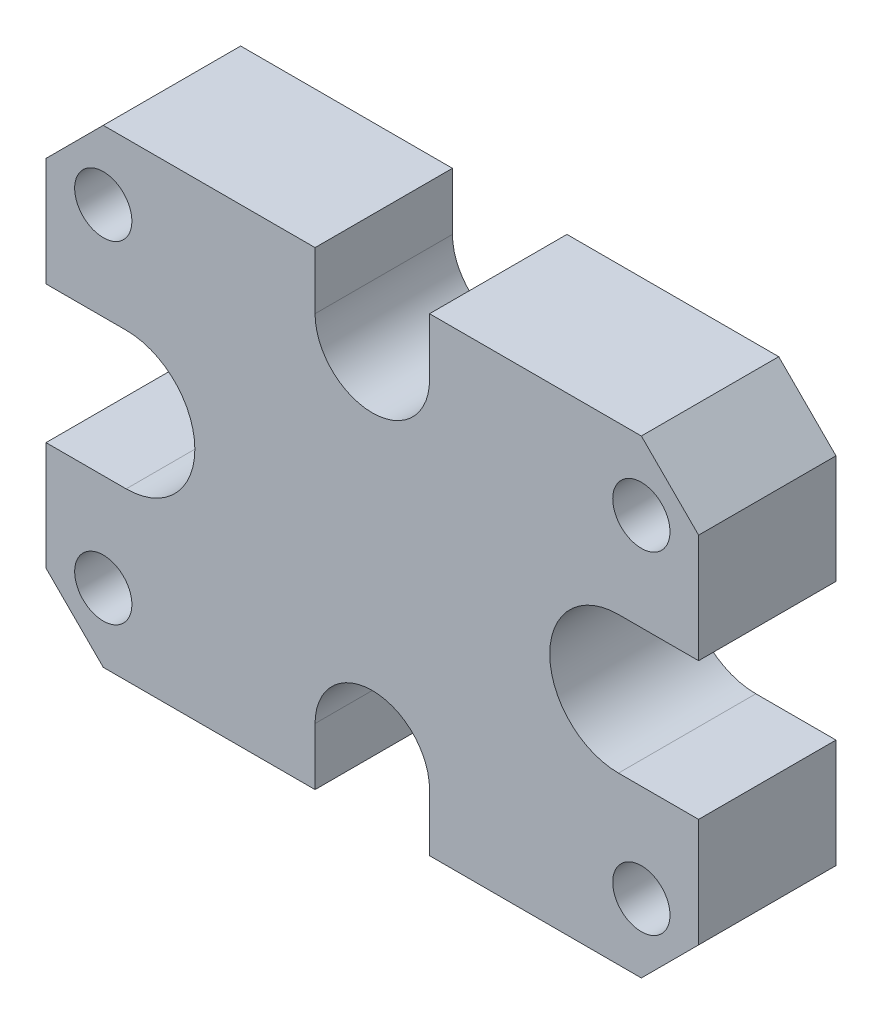
ISO-10303-21;
HEADER;
FILE_DESCRIPTION(('STEP AP214'),'2;1');
FILE_NAME('part.step','',(''),(''),'','','');
FILE_SCHEMA(('AUTOMOTIVE_DESIGN { 1 0 10303 214 1 1 1 1 }'));
ENDSEC;
DATA;
#1=APPLICATION_CONTEXT('core data for automotive mechanical design processes');
#2=APPLICATION_PROTOCOL_DEFINITION('international standard','automotive_design',2000,#1);
#3=PRODUCT_CONTEXT('',#1,'mechanical');
#4=PRODUCT('Part','Part','',(#3));
#5=PRODUCT_RELATED_PRODUCT_CATEGORY('part','',(#4));
#6=PRODUCT_DEFINITION_FORMATION('','',#4);
#7=PRODUCT_DEFINITION_CONTEXT('part definition',#1,'design');
#8=PRODUCT_DEFINITION('design','',#6,#7);
#9=PRODUCT_DEFINITION_SHAPE('','',#8);
#10=(LENGTH_UNIT() NAMED_UNIT(*) SI_UNIT(.MILLI.,.METRE.));
#11=(NAMED_UNIT(*) PLANE_ANGLE_UNIT() SI_UNIT($,.RADIAN.));
#12=(NAMED_UNIT(*) SI_UNIT($,.STERADIAN.) SOLID_ANGLE_UNIT());
#13=UNCERTAINTY_MEASURE_WITH_UNIT(LENGTH_MEASURE(1.E-05),#10,'distance_accuracy_value','');
#14=(GEOMETRIC_REPRESENTATION_CONTEXT(3) GLOBAL_UNCERTAINTY_ASSIGNED_CONTEXT((#13)) GLOBAL_UNIT_ASSIGNED_CONTEXT((#10,
#11,#12)) REPRESENTATION_CONTEXT('',''));
#15=CARTESIAN_POINT('',(0.,0.,0.));
#16=DIRECTION('',(0.,0.,1.));
#17=DIRECTION('',(1.,0.,0.));
#18=AXIS2_PLACEMENT_3D('',#15,#16,#17);
#19=CARTESIAN_POINT('',(0.,31.,12.));
#20=DIRECTION('',(0.,0.,1.));
#21=DIRECTION('',(1.,0.,0.));
#22=AXIS2_PLACEMENT_3D('',#19,#20,#21);
#23=PLANE('',#22);
#24=CARTESIAN_POINT('',(47.,-29.,12.));
#25=DIRECTION('',(0.,0.,1.));
#26=DIRECTION('',(1.,0.,0.));
#27=AXIS2_PLACEMENT_3D('',#24,#25,#26);
#28=CIRCLE('',#27,5.);
#29=CARTESIAN_POINT('',(52.,-29.,12.));
#30=VERTEX_POINT('',#29);
#31=EDGE_CURVE('E447',#30,#30,#28,.T.);
#32=ORIENTED_EDGE('',*,*,#31,.F.);
#33=EDGE_LOOP('',(#32));
#34=FACE_BOUND('',#33,.T.);
#35=CARTESIAN_POINT('',(47.,29.,12.));
#36=DIRECTION('',(0.,0.,1.));
#37=DIRECTION('',(-1.,0.,0.));
#38=AXIS2_PLACEMENT_3D('',#35,#36,#37);
#39=CIRCLE('',#38,5.);
#40=CARTESIAN_POINT('',(42.,29.,12.));
#41=VERTEX_POINT('',#40);
#42=EDGE_CURVE('E230',#41,#41,#39,.T.);
#43=ORIENTED_EDGE('',*,*,#42,.F.);
#44=EDGE_LOOP('',(#43));
#45=FACE_BOUND('',#44,.T.);
#46=DIRECTION('',(-1.,0.,0.));
#47=VECTOR('',#46,1.);
#48=CARTESIAN_POINT('',(-47.,41.,12.));
#49=LINE('',#48,#47);
#50=CARTESIAN_POINT('',(-10.,41.,12.));
#51=VERTEX_POINT('',#50);
#52=CARTESIAN_POINT('',(-47.,41.,12.));
#53=VERTEX_POINT('',#52);
#54=EDGE_CURVE('E273',#51,#53,#49,.T.);
#55=ORIENTED_EDGE('',*,*,#54,.T.);
#56=DIRECTION('',(-0.707106781186548,-0.707106781186547,0.));
#57=VECTOR('',#56,1.);
#58=CARTESIAN_POINT('',(-57.,31.,12.));
#59=LINE('',#58,#57);
#60=CARTESIAN_POINT('',(-57.,31.,12.));
#61=VERTEX_POINT('',#60);
#62=EDGE_CURVE('E141',#53,#61,#59,.T.);
#63=ORIENTED_EDGE('',*,*,#62,.T.);
#64=DIRECTION('',(0.,-1.,0.));
#65=VECTOR('',#64,1.);
#66=CARTESIAN_POINT('',(-57.,31.,12.));
#67=LINE('',#66,#65);
#68=CARTESIAN_POINT('',(-57.,12.,12.));
#69=VERTEX_POINT('',#68);
#70=EDGE_CURVE('E336',#61,#69,#67,.T.);
#71=ORIENTED_EDGE('',*,*,#70,.T.);
#72=DIRECTION('',(1.,0.,0.));
#73=VECTOR('',#72,1.);
#74=CARTESIAN_POINT('',(-57.,12.,12.));
#75=LINE('',#74,#73);
#76=CARTESIAN_POINT('',(-43.,12.,12.));
#77=VERTEX_POINT('',#76);
#78=EDGE_CURVE('E355',#69,#77,#75,.T.);
#79=ORIENTED_EDGE('',*,*,#78,.T.);
#80=CARTESIAN_POINT('',(-43.,0.,12.));
#81=DIRECTION('',(0.,0.,-1.));
#82=DIRECTION('',(-1.,0.,0.));
#83=AXIS2_PLACEMENT_3D('',#80,#81,#82);
#84=CIRCLE('',#83,12.);
#85=CARTESIAN_POINT('',(-43.,-12.,12.));
#86=VERTEX_POINT('',#85);
#87=EDGE_CURVE('E352',#77,#86,#84,.T.);
#88=ORIENTED_EDGE('',*,*,#87,.T.);
#89=DIRECTION('',(-1.,0.,0.));
#90=VECTOR('',#89,1.);
#91=CARTESIAN_POINT('',(-43.,-12.,12.));
#92=LINE('',#91,#90);
#93=CARTESIAN_POINT('',(-57.,-12.,12.));
#94=VERTEX_POINT('',#93);
#95=EDGE_CURVE('E354',#86,#94,#92,.T.);
#96=ORIENTED_EDGE('',*,*,#95,.T.);
#97=DIRECTION('',(0.,-1.,0.));
#98=VECTOR('',#97,1.);
#99=CARTESIAN_POINT('',(-57.,-12.,12.));
#100=LINE('',#99,#98);
#101=CARTESIAN_POINT('',(-57.,-31.,12.));
#102=VERTEX_POINT('',#101);
#103=EDGE_CURVE('E357',#94,#102,#100,.T.);
#104=ORIENTED_EDGE('',*,*,#103,.T.);
#105=DIRECTION('',(0.707106781186548,-0.707106781186548,0.));
#106=VECTOR('',#105,1.);
#107=CARTESIAN_POINT('',(-57.,-31.,12.));
#108=LINE('',#107,#106);
#109=CARTESIAN_POINT('',(-47.,-41.,12.));
#110=VERTEX_POINT('',#109);
#111=EDGE_CURVE('E363',#102,#110,#108,.T.);
#112=ORIENTED_EDGE('',*,*,#111,.T.);
#113=DIRECTION('',(1.,0.,0.));
#114=VECTOR('',#113,1.);
#115=CARTESIAN_POINT('',(-47.,-41.,12.));
#116=LINE('',#115,#114);
#117=CARTESIAN_POINT('',(-10.,-41.,12.));
#118=VERTEX_POINT('',#117);
#119=EDGE_CURVE('E365',#110,#118,#116,.T.);
#120=ORIENTED_EDGE('',*,*,#119,.T.);
#121=DIRECTION('',(0.,1.,0.));
#122=VECTOR('',#121,1.);
#123=CARTESIAN_POINT('',(-10.,-41.,12.));
#124=LINE('',#123,#122);
#125=CARTESIAN_POINT('',(-10.,-31.,12.));
#126=VERTEX_POINT('',#125);
#127=EDGE_CURVE('E367',#118,#126,#124,.T.);
#128=ORIENTED_EDGE('',*,*,#127,.T.);
#129=CARTESIAN_POINT('',(0.,-31.,12.));
#130=DIRECTION('',(0.,0.,-1.));
#131=DIRECTION('',(-1.,0.,0.));
#132=AXIS2_PLACEMENT_3D('',#129,#130,#131);
#133=CIRCLE('',#132,10.);
#134=CARTESIAN_POINT('',(10.,-31.,12.));
#135=VERTEX_POINT('',#134);
#136=EDGE_CURVE('E369',#126,#135,#133,.T.);
#137=ORIENTED_EDGE('',*,*,#136,.T.);
#138=DIRECTION('',(0.,-1.,0.));
#139=VECTOR('',#138,1.);
#140=CARTESIAN_POINT('',(10.,-31.,12.));
#141=LINE('',#140,#139);
#142=CARTESIAN_POINT('',(9.99999999999999,-41.,12.));
#143=VERTEX_POINT('',#142);
#144=EDGE_CURVE('E371',#135,#143,#141,.T.);
#145=ORIENTED_EDGE('',*,*,#144,.T.);
#146=DIRECTION('',(1.,0.,0.));
#147=VECTOR('',#146,1.);
#148=CARTESIAN_POINT('',(9.99999999999999,-41.,12.));
#149=LINE('',#148,#147);
#150=CARTESIAN_POINT('',(47.,-41.,12.));
#151=VERTEX_POINT('',#150);
#152=EDGE_CURVE('E373',#143,#151,#149,.T.);
#153=ORIENTED_EDGE('',*,*,#152,.T.);
#154=DIRECTION('',(0.707106781186548,0.707106781186548,0.));
#155=VECTOR('',#154,1.);
#156=CARTESIAN_POINT('',(47.,-41.,12.));
#157=LINE('',#156,#155);
#158=CARTESIAN_POINT('',(57.,-31.,12.));
#159=VERTEX_POINT('',#158);
#160=EDGE_CURVE('E375',#151,#159,#157,.T.);
#161=ORIENTED_EDGE('',*,*,#160,.T.);
#162=DIRECTION('',(0.,1.,0.));
#163=VECTOR('',#162,1.);
#164=CARTESIAN_POINT('',(57.,-12.,12.));
#165=LINE('',#164,#163);
#166=CARTESIAN_POINT('',(57.,-12.,12.));
#167=VERTEX_POINT('',#166);
#168=EDGE_CURVE('E377',#159,#167,#165,.T.);
#169=ORIENTED_EDGE('',*,*,#168,.T.);
#170=DIRECTION('',(-1.,0.,0.));
#171=VECTOR('',#170,1.);
#172=CARTESIAN_POINT('',(43.,-12.,12.));
#173=LINE('',#172,#171);
#174=CARTESIAN_POINT('',(43.,-12.,12.));
#175=VERTEX_POINT('',#174);
#176=EDGE_CURVE('E379',#167,#175,#173,.T.);
#177=ORIENTED_EDGE('',*,*,#176,.T.);
#178=CARTESIAN_POINT('',(43.,0.,12.));
#179=DIRECTION('',(0.,0.,-1.));
#180=DIRECTION('',(1.,0.,0.));
#181=AXIS2_PLACEMENT_3D('',#178,#179,#180);
#182=CIRCLE('',#181,12.);
#183=CARTESIAN_POINT('',(43.,12.,12.));
#184=VERTEX_POINT('',#183);
#185=EDGE_CURVE('E381',#175,#184,#182,.T.);
#186=ORIENTED_EDGE('',*,*,#185,.T.);
#187=DIRECTION('',(1.,0.,0.));
#188=VECTOR('',#187,1.);
#189=CARTESIAN_POINT('',(57.,12.,12.));
#190=LINE('',#189,#188);
#191=CARTESIAN_POINT('',(57.,12.,12.));
#192=VERTEX_POINT('',#191);
#193=EDGE_CURVE('E383',#184,#192,#190,.T.);
#194=ORIENTED_EDGE('',*,*,#193,.T.);
#195=DIRECTION('',(0.,1.,0.));
#196=VECTOR('',#195,1.);
#197=CARTESIAN_POINT('',(57.,31.,12.));
#198=LINE('',#197,#196);
#199=CARTESIAN_POINT('',(57.,31.,12.));
#200=VERTEX_POINT('',#199);
#201=EDGE_CURVE('E385',#192,#200,#198,.T.);
#202=ORIENTED_EDGE('',*,*,#201,.T.);
#203=DIRECTION('',(-0.707106781186548,0.707106781186548,0.));
#204=VECTOR('',#203,1.);
#205=CARTESIAN_POINT('',(47.,41.,12.));
#206=LINE('',#205,#204);
#207=CARTESIAN_POINT('',(47.,41.,12.));
#208=VERTEX_POINT('',#207);
#209=EDGE_CURVE('E387',#200,#208,#206,.T.);
#210=ORIENTED_EDGE('',*,*,#209,.T.);
#211=DIRECTION('',(-1.,0.,0.));
#212=VECTOR('',#211,1.);
#213=CARTESIAN_POINT('',(9.99999999999999,41.,12.));
#214=LINE('',#213,#212);
#215=CARTESIAN_POINT('',(9.99999999999999,41.,12.));
#216=VERTEX_POINT('',#215);
#217=EDGE_CURVE('E208',#208,#216,#214,.T.);
#218=ORIENTED_EDGE('',*,*,#217,.T.);
#219=DIRECTION('',(0.,-1.,0.));
#220=VECTOR('',#219,1.);
#221=CARTESIAN_POINT('',(10.,31.,12.));
#222=LINE('',#221,#220);
#223=CARTESIAN_POINT('',(9.99999999999999,31.,12.));
#224=VERTEX_POINT('',#223);
#225=EDGE_CURVE('E202',#216,#224,#222,.T.);
#226=ORIENTED_EDGE('',*,*,#225,.T.);
#227=CARTESIAN_POINT('',(0.,31.,12.));
#228=DIRECTION('',(0.,0.,-1.));
#229=DIRECTION('',(1.,0.,0.));
#230=AXIS2_PLACEMENT_3D('',#227,#228,#229);
#231=CIRCLE('',#230,10.);
#232=CARTESIAN_POINT('',(-10.,31.,12.));
#233=VERTEX_POINT('',#232);
#234=EDGE_CURVE('E206',#224,#233,#231,.T.);
#235=ORIENTED_EDGE('',*,*,#234,.T.);
#236=DIRECTION('',(0.,1.,0.));
#237=VECTOR('',#236,1.);
#238=CARTESIAN_POINT('',(-10.,41.,12.));
#239=LINE('',#238,#237);
#240=EDGE_CURVE('E50',#233,#51,#239,.T.);
#241=ORIENTED_EDGE('',*,*,#240,.T.);
#242=EDGE_LOOP('',(#55,#63,#71,#79,#88,#96,#104,#112,#120,#128,#137,#145,#153,#161,#169,#177,
#186,#194,#202,#210,#218,#226,#235,#241));
#243=FACE_BOUND('',#242,.T.);
#244=CARTESIAN_POINT('',(-47.,-29.,12.));
#245=DIRECTION('',(0.,0.,1.));
#246=DIRECTION('',(-1.,0.,0.));
#247=AXIS2_PLACEMENT_3D('',#244,#245,#246);
#248=CIRCLE('',#247,5.);
#249=CARTESIAN_POINT('',(-52.,-29.,12.));
#250=VERTEX_POINT('',#249);
#251=EDGE_CURVE('E453',#250,#250,#248,.T.);
#252=ORIENTED_EDGE('',*,*,#251,.F.);
#253=EDGE_LOOP('',(#252));
#254=FACE_BOUND('',#253,.T.);
#255=CARTESIAN_POINT('',(-47.,29.,12.));
#256=DIRECTION('',(0.,0.,1.));
#257=DIRECTION('',(1.,0.,0.));
#258=AXIS2_PLACEMENT_3D('',#255,#256,#257);
#259=CIRCLE('',#258,5.);
#260=CARTESIAN_POINT('',(-42.,29.,12.));
#261=VERTEX_POINT('',#260);
#262=EDGE_CURVE('E438',#261,#261,#259,.T.);
#263=ORIENTED_EDGE('',*,*,#262,.F.);
#264=EDGE_LOOP('',(#263));
#265=FACE_BOUND('',#264,.T.);
#266=ADVANCED_FACE('F33',(#34,#45,#243,#254,#265),#23,.T.);
#267=CARTESIAN_POINT('',(0.,31.,-12.));
#268=DIRECTION('',(0.,0.,1.));
#269=DIRECTION('',(1.,0.,0.));
#270=AXIS2_PLACEMENT_3D('',#267,#268,#269);
#271=PLANE('',#270);
#272=DIRECTION('',(-1.,0.,0.));
#273=VECTOR('',#272,1.);
#274=CARTESIAN_POINT('',(-47.,41.,-12.));
#275=LINE('',#274,#273);
#276=CARTESIAN_POINT('',(-10.,41.,-12.));
#277=VERTEX_POINT('',#276);
#278=CARTESIAN_POINT('',(-47.,41.,-12.));
#279=VERTEX_POINT('',#278);
#280=EDGE_CURVE('E226',#277,#279,#275,.T.);
#281=ORIENTED_EDGE('',*,*,#280,.F.);
#282=DIRECTION('',(0.,1.,0.));
#283=VECTOR('',#282,1.);
#284=CARTESIAN_POINT('',(-10.,41.,-12.));
#285=LINE('',#284,#283);
#286=CARTESIAN_POINT('',(-10.,31.,-12.));
#287=VERTEX_POINT('',#286);
#288=EDGE_CURVE('E133',#287,#277,#285,.T.);
#289=ORIENTED_EDGE('',*,*,#288,.F.);
#290=CARTESIAN_POINT('',(0.,31.,-12.));
#291=DIRECTION('',(0.,0.,-1.));
#292=DIRECTION('',(1.,0.,0.));
#293=AXIS2_PLACEMENT_3D('',#290,#291,#292);
#294=CIRCLE('',#293,10.);
#295=CARTESIAN_POINT('',(9.99999999999999,31.,-12.));
#296=VERTEX_POINT('',#295);
#297=EDGE_CURVE('E127',#296,#287,#294,.T.);
#298=ORIENTED_EDGE('',*,*,#297,.F.);
#299=DIRECTION('',(0.,-1.,0.));
#300=VECTOR('',#299,1.);
#301=CARTESIAN_POINT('',(10.,31.,-12.));
#302=LINE('',#301,#300);
#303=CARTESIAN_POINT('',(9.99999999999999,41.,-12.));
#304=VERTEX_POINT('',#303);
#305=EDGE_CURVE('E216',#304,#296,#302,.T.);
#306=ORIENTED_EDGE('',*,*,#305,.F.);
#307=DIRECTION('',(-1.,0.,0.));
#308=VECTOR('',#307,1.);
#309=CARTESIAN_POINT('',(9.99999999999999,41.,-12.));
#310=LINE('',#309,#308);
#311=CARTESIAN_POINT('',(47.,41.,-12.));
#312=VERTEX_POINT('',#311);
#313=EDGE_CURVE('E268',#312,#304,#310,.T.);
#314=ORIENTED_EDGE('',*,*,#313,.F.);
#315=DIRECTION('',(-0.707106781186548,0.707106781186548,0.));
#316=VECTOR('',#315,1.);
#317=CARTESIAN_POINT('',(47.,41.,-12.));
#318=LINE('',#317,#316);
#319=CARTESIAN_POINT('',(57.,31.,-12.));
#320=VERTEX_POINT('',#319);
#321=EDGE_CURVE('E266',#320,#312,#318,.T.);
#322=ORIENTED_EDGE('',*,*,#321,.F.);
#323=DIRECTION('',(0.,1.,0.));
#324=VECTOR('',#323,1.);
#325=CARTESIAN_POINT('',(57.,31.,-12.));
#326=LINE('',#325,#324);
#327=CARTESIAN_POINT('',(57.,12.,-12.));
#328=VERTEX_POINT('',#327);
#329=EDGE_CURVE('E264',#328,#320,#326,.T.);
#330=ORIENTED_EDGE('',*,*,#329,.F.);
#331=DIRECTION('',(1.,0.,0.));
#332=VECTOR('',#331,1.);
#333=CARTESIAN_POINT('',(57.,12.,-12.));
#334=LINE('',#333,#332);
#335=CARTESIAN_POINT('',(43.,12.,-12.));
#336=VERTEX_POINT('',#335);
#337=EDGE_CURVE('E262',#336,#328,#334,.T.);
#338=ORIENTED_EDGE('',*,*,#337,.F.);
#339=CARTESIAN_POINT('',(43.,0.,-12.));
#340=DIRECTION('',(0.,0.,-1.));
#341=DIRECTION('',(1.,0.,0.));
#342=AXIS2_PLACEMENT_3D('',#339,#340,#341);
#343=CIRCLE('',#342,12.);
#344=CARTESIAN_POINT('',(43.,-12.,-12.));
#345=VERTEX_POINT('',#344);
#346=EDGE_CURVE('E260',#345,#336,#343,.T.);
#347=ORIENTED_EDGE('',*,*,#346,.F.);
#348=DIRECTION('',(-1.,0.,0.));
#349=VECTOR('',#348,1.);
#350=CARTESIAN_POINT('',(43.,-12.,-12.));
#351=LINE('',#350,#349);
#352=CARTESIAN_POINT('',(57.,-12.,-12.));
#353=VERTEX_POINT('',#352);
#354=EDGE_CURVE('E258',#353,#345,#351,.T.);
#355=ORIENTED_EDGE('',*,*,#354,.F.);
#356=DIRECTION('',(0.,1.,0.));
#357=VECTOR('',#356,1.);
#358=CARTESIAN_POINT('',(57.,-12.,-12.));
#359=LINE('',#358,#357);
#360=CARTESIAN_POINT('',(57.,-31.,-12.));
#361=VERTEX_POINT('',#360);
#362=EDGE_CURVE('E256',#361,#353,#359,.T.);
#363=ORIENTED_EDGE('',*,*,#362,.F.);
#364=DIRECTION('',(0.707106781186548,0.707106781186548,0.));
#365=VECTOR('',#364,1.);
#366=CARTESIAN_POINT('',(47.,-41.,-12.));
#367=LINE('',#366,#365);
#368=CARTESIAN_POINT('',(47.,-41.,-12.));
#369=VERTEX_POINT('',#368);
#370=EDGE_CURVE('E254',#369,#361,#367,.T.);
#371=ORIENTED_EDGE('',*,*,#370,.F.);
#372=DIRECTION('',(1.,0.,0.));
#373=VECTOR('',#372,1.);
#374=CARTESIAN_POINT('',(9.99999999999999,-41.,-12.));
#375=LINE('',#374,#373);
#376=CARTESIAN_POINT('',(9.99999999999999,-41.,-12.));
#377=VERTEX_POINT('',#376);
#378=EDGE_CURVE('E252',#377,#369,#375,.T.);
#379=ORIENTED_EDGE('',*,*,#378,.F.);
#380=DIRECTION('',(0.,-1.,0.));
#381=VECTOR('',#380,1.);
#382=CARTESIAN_POINT('',(10.,-31.,-12.));
#383=LINE('',#382,#381);
#384=CARTESIAN_POINT('',(10.,-31.,-12.));
#385=VERTEX_POINT('',#384);
#386=EDGE_CURVE('E250',#385,#377,#383,.T.);
#387=ORIENTED_EDGE('',*,*,#386,.F.);
#388=CARTESIAN_POINT('',(0.,-31.,-12.));
#389=DIRECTION('',(0.,0.,-1.));
#390=DIRECTION('',(-1.,0.,0.));
#391=AXIS2_PLACEMENT_3D('',#388,#389,#390);
#392=CIRCLE('',#391,10.);
#393=CARTESIAN_POINT('',(-10.,-31.,-12.));
#394=VERTEX_POINT('',#393);
#395=EDGE_CURVE('E248',#394,#385,#392,.T.);
#396=ORIENTED_EDGE('',*,*,#395,.F.);
#397=DIRECTION('',(0.,1.,0.));
#398=VECTOR('',#397,1.);
#399=CARTESIAN_POINT('',(-10.,-41.,-12.));
#400=LINE('',#399,#398);
#401=CARTESIAN_POINT('',(-10.,-41.,-12.));
#402=VERTEX_POINT('',#401);
#403=EDGE_CURVE('E246',#402,#394,#400,.T.);
#404=ORIENTED_EDGE('',*,*,#403,.F.);
#405=DIRECTION('',(1.,0.,0.));
#406=VECTOR('',#405,1.);
#407=CARTESIAN_POINT('',(-47.,-41.,-12.));
#408=LINE('',#407,#406);
#409=CARTESIAN_POINT('',(-47.,-41.,-12.));
#410=VERTEX_POINT('',#409);
#411=EDGE_CURVE('E244',#410,#402,#408,.T.);
#412=ORIENTED_EDGE('',*,*,#411,.F.);
#413=DIRECTION('',(0.707106781186548,-0.707106781186548,0.));
#414=VECTOR('',#413,1.);
#415=CARTESIAN_POINT('',(-57.,-31.,-12.));
#416=LINE('',#415,#414);
#417=CARTESIAN_POINT('',(-57.,-31.,-12.));
#418=VERTEX_POINT('',#417);
#419=EDGE_CURVE('E242',#418,#410,#416,.T.);
#420=ORIENTED_EDGE('',*,*,#419,.F.);
#421=DIRECTION('',(0.,-1.,0.));
#422=VECTOR('',#421,1.);
#423=CARTESIAN_POINT('',(-57.,-12.,-12.));
#424=LINE('',#423,#422);
#425=CARTESIAN_POINT('',(-57.,-12.,-12.));
#426=VERTEX_POINT('',#425);
#427=EDGE_CURVE('E240',#426,#418,#424,.T.);
#428=ORIENTED_EDGE('',*,*,#427,.F.);
#429=DIRECTION('',(-1.,0.,0.));
#430=VECTOR('',#429,1.);
#431=CARTESIAN_POINT('',(-43.,-12.,-12.));
#432=LINE('',#431,#430);
#433=CARTESIAN_POINT('',(-43.,-12.,-12.));
#434=VERTEX_POINT('',#433);
#435=EDGE_CURVE('E238',#434,#426,#432,.T.);
#436=ORIENTED_EDGE('',*,*,#435,.F.);
#437=CARTESIAN_POINT('',(-43.,0.,-12.));
#438=DIRECTION('',(0.,0.,-1.));
#439=DIRECTION('',(-1.,0.,0.));
#440=AXIS2_PLACEMENT_3D('',#437,#438,#439);
#441=CIRCLE('',#440,12.);
#442=CARTESIAN_POINT('',(-43.,12.,-12.));
#443=VERTEX_POINT('',#442);
#444=EDGE_CURVE('E236',#443,#434,#441,.T.);
#445=ORIENTED_EDGE('',*,*,#444,.F.);
#446=DIRECTION('',(1.,0.,0.));
#447=VECTOR('',#446,1.);
#448=CARTESIAN_POINT('',(-57.,12.,-12.));
#449=LINE('',#448,#447);
#450=CARTESIAN_POINT('',(-57.,12.,-12.));
#451=VERTEX_POINT('',#450);
#452=EDGE_CURVE('E234',#451,#443,#449,.T.);
#453=ORIENTED_EDGE('',*,*,#452,.F.);
#454=DIRECTION('',(0.,-1.,0.));
#455=VECTOR('',#454,1.);
#456=CARTESIAN_POINT('',(-57.,31.,-12.));
#457=LINE('',#456,#455);
#458=CARTESIAN_POINT('',(-57.,31.,-12.));
#459=VERTEX_POINT('',#458);
#460=EDGE_CURVE('E232',#459,#451,#457,.T.);
#461=ORIENTED_EDGE('',*,*,#460,.F.);
#462=DIRECTION('',(-0.707106781186548,-0.707106781186547,0.));
#463=VECTOR('',#462,1.);
#464=CARTESIAN_POINT('',(-57.,31.,-12.));
#465=LINE('',#464,#463);
#466=EDGE_CURVE('E229',#279,#459,#465,.T.);
#467=ORIENTED_EDGE('',*,*,#466,.F.);
#468=EDGE_LOOP('',(#281,#289,#298,#306,#314,#322,#330,#338,#347,#355,#363,#371,#379,#387,#396,
#404,#412,#420,#428,#436,#445,#453,#461,#467));
#469=FACE_BOUND('',#468,.T.);
#470=CARTESIAN_POINT('',(47.,29.,-12.));
#471=DIRECTION('',(0.,0.,1.));
#472=DIRECTION('',(-1.,0.,0.));
#473=AXIS2_PLACEMENT_3D('',#470,#471,#472);
#474=CIRCLE('',#473,5.);
#475=CARTESIAN_POINT('',(42.,29.,-12.));
#476=VERTEX_POINT('',#475);
#477=EDGE_CURVE('E456',#476,#476,#474,.T.);
#478=ORIENTED_EDGE('',*,*,#477,.T.);
#479=EDGE_LOOP('',(#478));
#480=FACE_BOUND('',#479,.T.);
#481=CARTESIAN_POINT('',(-47.,-29.,-12.));
#482=DIRECTION('',(0.,0.,1.));
#483=DIRECTION('',(-1.,0.,0.));
#484=AXIS2_PLACEMENT_3D('',#481,#482,#483);
#485=CIRCLE('',#484,5.);
#486=CARTESIAN_POINT('',(-52.,-29.,-12.));
#487=VERTEX_POINT('',#486);
#488=EDGE_CURVE('E450',#487,#487,#485,.T.);
#489=ORIENTED_EDGE('',*,*,#488,.T.);
#490=EDGE_LOOP('',(#489));
#491=FACE_BOUND('',#490,.T.);
#492=CARTESIAN_POINT('',(47.,-29.,-12.));
#493=DIRECTION('',(0.,0.,1.));
#494=DIRECTION('',(1.,0.,0.));
#495=AXIS2_PLACEMENT_3D('',#492,#493,#494);
#496=CIRCLE('',#495,5.);
#497=CARTESIAN_POINT('',(52.,-29.,-12.));
#498=VERTEX_POINT('',#497);
#499=EDGE_CURVE('E444',#498,#498,#496,.T.);
#500=ORIENTED_EDGE('',*,*,#499,.T.);
#501=EDGE_LOOP('',(#500));
#502=FACE_BOUND('',#501,.T.);
#503=CARTESIAN_POINT('',(-47.,29.,-12.));
#504=DIRECTION('',(0.,0.,1.));
#505=DIRECTION('',(1.,0.,0.));
#506=AXIS2_PLACEMENT_3D('',#503,#504,#505);
#507=CIRCLE('',#506,5.);
#508=CARTESIAN_POINT('',(-42.,29.,-12.));
#509=VERTEX_POINT('',#508);
#510=EDGE_CURVE('E441',#509,#509,#507,.T.);
#511=ORIENTED_EDGE('',*,*,#510,.T.);
#512=EDGE_LOOP('',(#511));
#513=FACE_BOUND('',#512,.T.);
#514=ADVANCED_FACE('F340',(#469,#480,#491,#502,#513),#271,.F.);
#515=CARTESIAN_POINT('',(-47.,41.,12.));
#516=DIRECTION('',(0.,-1.,0.));
#517=DIRECTION('',(1.,0.,0.));
#518=AXIS2_PLACEMENT_3D('',#515,#516,#517);
#519=PLANE('',#518);
#520=ORIENTED_EDGE('',*,*,#280,.T.);
#521=DIRECTION('',(0.,0.,-1.));
#522=VECTOR('',#521,1.);
#523=CARTESIAN_POINT('',(-47.,41.,12.));
#524=LINE('',#523,#522);
#525=EDGE_CURVE('E11',#53,#279,#524,.T.);
#526=ORIENTED_EDGE('',*,*,#525,.F.);
#527=ORIENTED_EDGE('',*,*,#54,.F.);
#528=DIRECTION('',(0.,0.,-1.));
#529=VECTOR('',#528,1.);
#530=CARTESIAN_POINT('',(-10.,41.,12.));
#531=LINE('',#530,#529);
#532=EDGE_CURVE('E222',#51,#277,#531,.T.);
#533=ORIENTED_EDGE('',*,*,#532,.T.);
#534=EDGE_LOOP('',(#520,#526,#527,#533));
#535=FACE_BOUND('',#534,.T.);
#536=ADVANCED_FACE('F35',(#535),#519,.F.);
#537=CARTESIAN_POINT('',(-57.,31.,12.));
#538=DIRECTION('',(0.707106781186547,-0.707106781186548,0.));
#539=DIRECTION('',(0.707106781186548,0.707106781186547,0.));
#540=AXIS2_PLACEMENT_3D('',#537,#538,#539);
#541=PLANE('',#540);
#542=ORIENTED_EDGE('',*,*,#466,.T.);
#543=DIRECTION('',(0.,0.,-1.));
#544=VECTOR('',#543,1.);
#545=CARTESIAN_POINT('',(-57.,31.,12.));
#546=LINE('',#545,#544);
#547=EDGE_CURVE('E42',#61,#459,#546,.T.);
#548=ORIENTED_EDGE('',*,*,#547,.F.);
#549=ORIENTED_EDGE('',*,*,#62,.F.);
#550=ORIENTED_EDGE('',*,*,#525,.T.);
#551=EDGE_LOOP('',(#542,#548,#549,#550));
#552=FACE_BOUND('',#551,.T.);
#553=ADVANCED_FACE('F686',(#552),#541,.F.);
#554=CARTESIAN_POINT('',(-57.,31.,12.));
#555=DIRECTION('',(1.,0.,0.));
#556=DIRECTION('',(0.,1.,0.));
#557=AXIS2_PLACEMENT_3D('',#554,#555,#556);
#558=PLANE('',#557);
#559=ORIENTED_EDGE('',*,*,#460,.T.);
#560=DIRECTION('',(0.,0.,-1.));
#561=VECTOR('',#560,1.);
#562=CARTESIAN_POINT('',(-57.,12.,12.));
#563=LINE('',#562,#561);
#564=EDGE_CURVE('E328',#69,#451,#563,.T.);
#565=ORIENTED_EDGE('',*,*,#564,.F.);
#566=ORIENTED_EDGE('',*,*,#70,.F.);
#567=ORIENTED_EDGE('',*,*,#547,.T.);
#568=EDGE_LOOP('',(#559,#565,#566,#567));
#569=FACE_BOUND('',#568,.T.);
#570=ADVANCED_FACE('F334',(#569),#558,.F.);
#571=CARTESIAN_POINT('',(-57.,12.,12.));
#572=DIRECTION('',(0.,1.,0.));
#573=DIRECTION('',(-1.,0.,0.));
#574=AXIS2_PLACEMENT_3D('',#571,#572,#573);
#575=PLANE('',#574);
#576=ORIENTED_EDGE('',*,*,#452,.T.);
#577=DIRECTION('',(0.,0.,-1.));
#578=VECTOR('',#577,1.);
#579=CARTESIAN_POINT('',(-43.,12.,12.));
#580=LINE('',#579,#578);
#581=EDGE_CURVE('E325',#77,#443,#580,.T.);
#582=ORIENTED_EDGE('',*,*,#581,.F.);
#583=ORIENTED_EDGE('',*,*,#78,.F.);
#584=ORIENTED_EDGE('',*,*,#564,.T.);
#585=EDGE_LOOP('',(#576,#582,#583,#584));
#586=FACE_BOUND('',#585,.T.);
#587=ADVANCED_FACE('F346',(#586),#575,.F.);
#588=CARTESIAN_POINT('',(-43.,0.,12.));
#589=DIRECTION('',(0.,0.,-1.));
#590=DIRECTION('',(-1.,0.,0.));
#591=AXIS2_PLACEMENT_3D('',#588,#589,#590);
#592=CYLINDRICAL_SURFACE('',#591,12.);
#593=ORIENTED_EDGE('',*,*,#444,.T.);
#594=DIRECTION('',(0.,0.,-1.));
#595=VECTOR('',#594,1.);
#596=CARTESIAN_POINT('',(-43.,-12.,12.));
#597=LINE('',#596,#595);
#598=EDGE_CURVE('E322',#86,#434,#597,.T.);
#599=ORIENTED_EDGE('',*,*,#598,.F.);
#600=ORIENTED_EDGE('',*,*,#87,.F.);
#601=ORIENTED_EDGE('',*,*,#581,.T.);
#602=EDGE_LOOP('',(#593,#599,#600,#601));
#603=FACE_BOUND('',#602,.T.);
#604=ADVANCED_FACE('F350',(#603),#592,.F.);
#605=CARTESIAN_POINT('',(-43.,-12.,12.));
#606=DIRECTION('',(0.,-1.,0.));
#607=DIRECTION('',(1.,0.,0.));
#608=AXIS2_PLACEMENT_3D('',#605,#606,#607);
#609=PLANE('',#608);
#610=ORIENTED_EDGE('',*,*,#435,.T.);
#611=DIRECTION('',(0.,0.,-1.));
#612=VECTOR('',#611,1.);
#613=CARTESIAN_POINT('',(-57.,-12.,12.));
#614=LINE('',#613,#612);
#615=EDGE_CURVE('E319',#94,#426,#614,.T.);
#616=ORIENTED_EDGE('',*,*,#615,.F.);
#617=ORIENTED_EDGE('',*,*,#95,.F.);
#618=ORIENTED_EDGE('',*,*,#598,.T.);
#619=EDGE_LOOP('',(#610,#616,#617,#618));
#620=FACE_BOUND('',#619,.T.);
#621=ADVANCED_FACE('F651',(#620),#609,.F.);
#622=CARTESIAN_POINT('',(-57.,-12.,12.));
#623=DIRECTION('',(1.,0.,0.));
#624=DIRECTION('',(0.,1.,0.));
#625=AXIS2_PLACEMENT_3D('',#622,#623,#624);
#626=PLANE('',#625);
#627=ORIENTED_EDGE('',*,*,#427,.T.);
#628=DIRECTION('',(0.,0.,-1.));
#629=VECTOR('',#628,1.);
#630=CARTESIAN_POINT('',(-57.,-31.,12.));
#631=LINE('',#630,#629);
#632=EDGE_CURVE('E316',#102,#418,#631,.T.);
#633=ORIENTED_EDGE('',*,*,#632,.F.);
#634=ORIENTED_EDGE('',*,*,#103,.F.);
#635=ORIENTED_EDGE('',*,*,#615,.T.);
#636=EDGE_LOOP('',(#627,#633,#634,#635));
#637=FACE_BOUND('',#636,.T.);
#638=ADVANCED_FACE('F641',(#637),#626,.F.);
#639=CARTESIAN_POINT('',(-57.,-31.,12.));
#640=DIRECTION('',(0.707106781186547,0.707106781186547,0.));
#641=DIRECTION('',(-0.707106781186548,0.707106781186548,0.));
#642=AXIS2_PLACEMENT_3D('',#639,#640,#641);
#643=PLANE('',#642);
#644=ORIENTED_EDGE('',*,*,#419,.T.);
#645=DIRECTION('',(0.,0.,-1.));
#646=VECTOR('',#645,1.);
#647=CARTESIAN_POINT('',(-47.,-41.,12.));
#648=LINE('',#647,#646);
#649=EDGE_CURVE('E313',#110,#410,#648,.T.);
#650=ORIENTED_EDGE('',*,*,#649,.F.);
#651=ORIENTED_EDGE('',*,*,#111,.F.);
#652=ORIENTED_EDGE('',*,*,#632,.T.);
#653=EDGE_LOOP('',(#644,#650,#651,#652));
#654=FACE_BOUND('',#653,.T.);
#655=ADVANCED_FACE('F631',(#654),#643,.F.);
#656=CARTESIAN_POINT('',(-47.,-41.,12.));
#657=DIRECTION('',(0.,1.,0.));
#658=DIRECTION('',(-1.,0.,0.));
#659=AXIS2_PLACEMENT_3D('',#656,#657,#658);
#660=PLANE('',#659);
#661=ORIENTED_EDGE('',*,*,#411,.T.);
#662=DIRECTION('',(0.,0.,-1.));
#663=VECTOR('',#662,1.);
#664=CARTESIAN_POINT('',(-10.,-41.,12.));
#665=LINE('',#664,#663);
#666=EDGE_CURVE('E310',#118,#402,#665,.T.);
#667=ORIENTED_EDGE('',*,*,#666,.F.);
#668=ORIENTED_EDGE('',*,*,#119,.F.);
#669=ORIENTED_EDGE('',*,*,#649,.T.);
#670=EDGE_LOOP('',(#661,#667,#668,#669));
#671=FACE_BOUND('',#670,.T.);
#672=ADVANCED_FACE('F621',(#671),#660,.F.);
#673=CARTESIAN_POINT('',(-10.,-41.,12.));
#674=DIRECTION('',(-1.,0.,0.));
#675=DIRECTION('',(0.,-1.,0.));
#676=AXIS2_PLACEMENT_3D('',#673,#674,#675);
#677=PLANE('',#676);
#678=ORIENTED_EDGE('',*,*,#403,.T.);
#679=DIRECTION('',(0.,0.,-1.));
#680=VECTOR('',#679,1.);
#681=CARTESIAN_POINT('',(-10.,-31.,12.));
#682=LINE('',#681,#680);
#683=EDGE_CURVE('E307',#126,#394,#682,.T.);
#684=ORIENTED_EDGE('',*,*,#683,.F.);
#685=ORIENTED_EDGE('',*,*,#127,.F.);
#686=ORIENTED_EDGE('',*,*,#666,.T.);
#687=EDGE_LOOP('',(#678,#684,#685,#686));
#688=FACE_BOUND('',#687,.T.);
#689=ADVANCED_FACE('F611',(#688),#677,.F.);
#690=CARTESIAN_POINT('',(0.,-31.,12.));
#691=DIRECTION('',(0.,0.,-1.));
#692=DIRECTION('',(-1.,0.,0.));
#693=AXIS2_PLACEMENT_3D('',#690,#691,#692);
#694=CYLINDRICAL_SURFACE('',#693,10.);
#695=ORIENTED_EDGE('',*,*,#395,.T.);
#696=DIRECTION('',(0.,0.,-1.));
#697=VECTOR('',#696,1.);
#698=CARTESIAN_POINT('',(10.,-31.,12.));
#699=LINE('',#698,#697);
#700=EDGE_CURVE('E304',#135,#385,#699,.T.);
#701=ORIENTED_EDGE('',*,*,#700,.F.);
#702=ORIENTED_EDGE('',*,*,#136,.F.);
#703=ORIENTED_EDGE('',*,*,#683,.T.);
#704=EDGE_LOOP('',(#695,#701,#702,#703));
#705=FACE_BOUND('',#704,.T.);
#706=ADVANCED_FACE('F601',(#705),#694,.F.);
#707=CARTESIAN_POINT('',(10.,-31.,12.));
#708=DIRECTION('',(1.,0.,0.));
#709=DIRECTION('',(0.,1.,0.));
#710=AXIS2_PLACEMENT_3D('',#707,#708,#709);
#711=PLANE('',#710);
#712=ORIENTED_EDGE('',*,*,#386,.T.);
#713=DIRECTION('',(0.,0.,-1.));
#714=VECTOR('',#713,1.);
#715=CARTESIAN_POINT('',(9.99999999999999,-41.,12.));
#716=LINE('',#715,#714);
#717=EDGE_CURVE('E301',#143,#377,#716,.T.);
#718=ORIENTED_EDGE('',*,*,#717,.F.);
#719=ORIENTED_EDGE('',*,*,#144,.F.);
#720=ORIENTED_EDGE('',*,*,#700,.T.);
#721=EDGE_LOOP('',(#712,#718,#719,#720));
#722=FACE_BOUND('',#721,.T.);
#723=ADVANCED_FACE('F591',(#722),#711,.F.);
#724=CARTESIAN_POINT('',(9.99999999999999,-41.,12.));
#725=DIRECTION('',(0.,1.,0.));
#726=DIRECTION('',(-1.,0.,0.));
#727=AXIS2_PLACEMENT_3D('',#724,#725,#726);
#728=PLANE('',#727);
#729=ORIENTED_EDGE('',*,*,#378,.T.);
#730=DIRECTION('',(0.,0.,-1.));
#731=VECTOR('',#730,1.);
#732=CARTESIAN_POINT('',(47.,-41.,12.));
#733=LINE('',#732,#731);
#734=EDGE_CURVE('E298',#151,#369,#733,.T.);
#735=ORIENTED_EDGE('',*,*,#734,.F.);
#736=ORIENTED_EDGE('',*,*,#152,.F.);
#737=ORIENTED_EDGE('',*,*,#717,.T.);
#738=EDGE_LOOP('',(#729,#735,#736,#737));
#739=FACE_BOUND('',#738,.T.);
#740=ADVANCED_FACE('F581',(#739),#728,.F.);
#741=CARTESIAN_POINT('',(47.,-41.,12.));
#742=DIRECTION('',(-0.707106781186547,0.707106781186547,0.));
#743=DIRECTION('',(-0.707106781186548,-0.707106781186548,0.));
#744=AXIS2_PLACEMENT_3D('',#741,#742,#743);
#745=PLANE('',#744);
#746=ORIENTED_EDGE('',*,*,#370,.T.);
#747=DIRECTION('',(0.,0.,-1.));
#748=VECTOR('',#747,1.);
#749=CARTESIAN_POINT('',(57.,-31.,12.));
#750=LINE('',#749,#748);
#751=EDGE_CURVE('E295',#159,#361,#750,.T.);
#752=ORIENTED_EDGE('',*,*,#751,.F.);
#753=ORIENTED_EDGE('',*,*,#160,.F.);
#754=ORIENTED_EDGE('',*,*,#734,.T.);
#755=EDGE_LOOP('',(#746,#752,#753,#754));
#756=FACE_BOUND('',#755,.T.);
#757=ADVANCED_FACE('F571',(#756),#745,.F.);
#758=CARTESIAN_POINT('',(57.,-12.,12.));
#759=DIRECTION('',(-1.,0.,0.));
#760=DIRECTION('',(0.,0.,1.));
#761=AXIS2_PLACEMENT_3D('',#758,#759,#760);
#762=PLANE('',#761);
#763=ORIENTED_EDGE('',*,*,#362,.T.);
#764=DIRECTION('',(0.,0.,-1.));
#765=VECTOR('',#764,1.);
#766=CARTESIAN_POINT('',(57.,-12.,12.));
#767=LINE('',#766,#765);
#768=EDGE_CURVE('E292',#167,#353,#767,.T.);
#769=ORIENTED_EDGE('',*,*,#768,.F.);
#770=ORIENTED_EDGE('',*,*,#168,.F.);
#771=ORIENTED_EDGE('',*,*,#751,.T.);
#772=EDGE_LOOP('',(#763,#769,#770,#771));
#773=FACE_BOUND('',#772,.T.);
#774=ADVANCED_FACE('F561',(#773),#762,.F.);
#775=CARTESIAN_POINT('',(43.,-12.,12.));
#776=DIRECTION('',(0.,-1.,0.));
#777=DIRECTION('',(1.,0.,0.));
#778=AXIS2_PLACEMENT_3D('',#775,#776,#777);
#779=PLANE('',#778);
#780=ORIENTED_EDGE('',*,*,#354,.T.);
#781=DIRECTION('',(0.,0.,-1.));
#782=VECTOR('',#781,1.);
#783=CARTESIAN_POINT('',(43.,-12.,12.));
#784=LINE('',#783,#782);
#785=EDGE_CURVE('E289',#175,#345,#784,.T.);
#786=ORIENTED_EDGE('',*,*,#785,.F.);
#787=ORIENTED_EDGE('',*,*,#176,.F.);
#788=ORIENTED_EDGE('',*,*,#768,.T.);
#789=EDGE_LOOP('',(#780,#786,#787,#788));
#790=FACE_BOUND('',#789,.T.);
#791=ADVANCED_FACE('F551',(#790),#779,.F.);
#792=CARTESIAN_POINT('',(43.,0.,12.));
#793=DIRECTION('',(0.,0.,-1.));
#794=DIRECTION('',(-1.,0.,0.));
#795=AXIS2_PLACEMENT_3D('',#792,#793,#794);
#796=CYLINDRICAL_SURFACE('',#795,12.);
#797=ORIENTED_EDGE('',*,*,#346,.T.);
#798=DIRECTION('',(0.,0.,-1.));
#799=VECTOR('',#798,1.);
#800=CARTESIAN_POINT('',(43.,12.,12.));
#801=LINE('',#800,#799);
#802=EDGE_CURVE('E286',#184,#336,#801,.T.);
#803=ORIENTED_EDGE('',*,*,#802,.F.);
#804=ORIENTED_EDGE('',*,*,#185,.F.);
#805=ORIENTED_EDGE('',*,*,#785,.T.);
#806=EDGE_LOOP('',(#797,#803,#804,#805));
#807=FACE_BOUND('',#806,.T.);
#808=ADVANCED_FACE('F541',(#807),#796,.F.);
#809=CARTESIAN_POINT('',(57.,12.,12.));
#810=DIRECTION('',(0.,1.,0.));
#811=DIRECTION('',(-1.,0.,0.));
#812=AXIS2_PLACEMENT_3D('',#809,#810,#811);
#813=PLANE('',#812);
#814=ORIENTED_EDGE('',*,*,#337,.T.);
#815=DIRECTION('',(0.,0.,-1.));
#816=VECTOR('',#815,1.);
#817=CARTESIAN_POINT('',(57.,12.,12.));
#818=LINE('',#817,#816);
#819=EDGE_CURVE('E283',#192,#328,#818,.T.);
#820=ORIENTED_EDGE('',*,*,#819,.F.);
#821=ORIENTED_EDGE('',*,*,#193,.F.);
#822=ORIENTED_EDGE('',*,*,#802,.T.);
#823=EDGE_LOOP('',(#814,#820,#821,#822));
#824=FACE_BOUND('',#823,.T.);
#825=ADVANCED_FACE('F531',(#824),#813,.F.);
#826=CARTESIAN_POINT('',(57.,31.,12.));
#827=DIRECTION('',(-1.,0.,0.));
#828=DIRECTION('',(0.,-1.,0.));
#829=AXIS2_PLACEMENT_3D('',#826,#827,#828);
#830=PLANE('',#829);
#831=ORIENTED_EDGE('',*,*,#329,.T.);
#832=DIRECTION('',(0.,0.,-1.));
#833=VECTOR('',#832,1.);
#834=CARTESIAN_POINT('',(57.,31.,12.));
#835=LINE('',#834,#833);
#836=EDGE_CURVE('E280',#200,#320,#835,.T.);
#837=ORIENTED_EDGE('',*,*,#836,.F.);
#838=ORIENTED_EDGE('',*,*,#201,.F.);
#839=ORIENTED_EDGE('',*,*,#819,.T.);
#840=EDGE_LOOP('',(#831,#837,#838,#839));
#841=FACE_BOUND('',#840,.T.);
#842=ADVANCED_FACE('F522',(#841),#830,.F.);
#843=CARTESIAN_POINT('',(47.,41.,12.));
#844=DIRECTION('',(-0.707106781186547,-0.707106781186547,0.));
#845=DIRECTION('',(0.707106781186548,-0.707106781186548,0.));
#846=AXIS2_PLACEMENT_3D('',#843,#844,#845);
#847=PLANE('',#846);
#848=ORIENTED_EDGE('',*,*,#321,.T.);
#849=DIRECTION('',(0.,0.,-1.));
#850=VECTOR('',#849,1.);
#851=CARTESIAN_POINT('',(47.,41.,12.));
#852=LINE('',#851,#850);
#853=EDGE_CURVE('E277',#208,#312,#852,.T.);
#854=ORIENTED_EDGE('',*,*,#853,.F.);
#855=ORIENTED_EDGE('',*,*,#209,.F.);
#856=ORIENTED_EDGE('',*,*,#836,.T.);
#857=EDGE_LOOP('',(#848,#854,#855,#856));
#858=FACE_BOUND('',#857,.T.);
#859=ADVANCED_FACE('F393',(#858),#847,.F.);
#860=CARTESIAN_POINT('',(9.99999999999999,41.,12.));
#861=DIRECTION('',(0.,-1.,0.));
#862=DIRECTION('',(0.,0.,-1.));
#863=AXIS2_PLACEMENT_3D('',#860,#861,#862);
#864=PLANE('',#863);
#865=ORIENTED_EDGE('',*,*,#313,.T.);
#866=DIRECTION('',(0.,0.,-1.));
#867=VECTOR('',#866,1.);
#868=CARTESIAN_POINT('',(9.99999999999999,41.,12.));
#869=LINE('',#868,#867);
#870=EDGE_CURVE('E217',#216,#304,#869,.T.);
#871=ORIENTED_EDGE('',*,*,#870,.F.);
#872=ORIENTED_EDGE('',*,*,#217,.F.);
#873=ORIENTED_EDGE('',*,*,#853,.T.);
#874=EDGE_LOOP('',(#865,#871,#872,#873));
#875=FACE_BOUND('',#874,.T.);
#876=ADVANCED_FACE('F397',(#875),#864,.F.);
#877=CARTESIAN_POINT('',(10.,31.,12.));
#878=DIRECTION('',(1.,0.,0.));
#879=DIRECTION('',(0.,1.,0.));
#880=AXIS2_PLACEMENT_3D('',#877,#878,#879);
#881=PLANE('',#880);
#882=ORIENTED_EDGE('',*,*,#305,.T.);
#883=DIRECTION('',(0.,0.,-1.));
#884=VECTOR('',#883,1.);
#885=CARTESIAN_POINT('',(9.99999999999999,31.,12.));
#886=LINE('',#885,#884);
#887=EDGE_CURVE('E213',#224,#296,#886,.T.);
#888=ORIENTED_EDGE('',*,*,#887,.F.);
#889=ORIENTED_EDGE('',*,*,#225,.F.);
#890=ORIENTED_EDGE('',*,*,#870,.T.);
#891=EDGE_LOOP('',(#882,#888,#889,#890));
#892=FACE_BOUND('',#891,.T.);
#893=ADVANCED_FACE('F214',(#892),#881,.F.);
#894=CARTESIAN_POINT('',(0.,31.,12.));
#895=DIRECTION('',(0.,0.,-1.));
#896=DIRECTION('',(-1.,0.,0.));
#897=AXIS2_PLACEMENT_3D('',#894,#895,#896);
#898=CYLINDRICAL_SURFACE('',#897,10.);
#899=ORIENTED_EDGE('',*,*,#297,.T.);
#900=DIRECTION('',(0.,0.,-1.));
#901=VECTOR('',#900,1.);
#902=CARTESIAN_POINT('',(-10.,31.,12.));
#903=LINE('',#902,#901);
#904=EDGE_CURVE('E218',#233,#287,#903,.T.);
#905=ORIENTED_EDGE('',*,*,#904,.F.);
#906=ORIENTED_EDGE('',*,*,#234,.F.);
#907=ORIENTED_EDGE('',*,*,#887,.T.);
#908=EDGE_LOOP('',(#899,#905,#906,#907));
#909=FACE_BOUND('',#908,.T.);
#910=ADVANCED_FACE('F220',(#909),#898,.F.);
#911=CARTESIAN_POINT('',(-10.,41.,12.));
#912=DIRECTION('',(-1.,0.,0.));
#913=DIRECTION('',(0.,-1.,0.));
#914=AXIS2_PLACEMENT_3D('',#911,#912,#913);
#915=PLANE('',#914);
#916=ORIENTED_EDGE('',*,*,#288,.T.);
#917=ORIENTED_EDGE('',*,*,#532,.F.);
#918=ORIENTED_EDGE('',*,*,#240,.F.);
#919=ORIENTED_EDGE('',*,*,#904,.T.);
#920=EDGE_LOOP('',(#916,#917,#918,#919));
#921=FACE_BOUND('',#920,.T.);
#922=ADVANCED_FACE('F401',(#921),#915,.F.);
#923=CARTESIAN_POINT('',(47.,29.,12.));
#924=DIRECTION('',(0.,0.,-1.));
#925=DIRECTION('',(-1.,0.,0.));
#926=AXIS2_PLACEMENT_3D('',#923,#924,#925);
#927=CYLINDRICAL_SURFACE('',#926,5.);
#928=ORIENTED_EDGE('',*,*,#42,.T.);
#929=EDGE_LOOP('',(#928));
#930=FACE_BOUND('',#929,.T.);
#931=ORIENTED_EDGE('',*,*,#477,.F.);
#932=EDGE_LOOP('',(#931));
#933=FACE_BOUND('',#932,.T.);
#934=ADVANCED_FACE('F403',(#930,#933),#927,.F.);
#935=CARTESIAN_POINT('',(-47.,-29.,12.));
#936=DIRECTION('',(0.,0.,-1.));
#937=DIRECTION('',(-1.,0.,0.));
#938=AXIS2_PLACEMENT_3D('',#935,#936,#937);
#939=CYLINDRICAL_SURFACE('',#938,5.);
#940=ORIENTED_EDGE('',*,*,#251,.T.);
#941=EDGE_LOOP('',(#940));
#942=FACE_BOUND('',#941,.T.);
#943=ORIENTED_EDGE('',*,*,#488,.F.);
#944=EDGE_LOOP('',(#943));
#945=FACE_BOUND('',#944,.T.);
#946=ADVANCED_FACE('F409',(#942,#945),#939,.F.);
#947=CARTESIAN_POINT('',(47.,-29.,12.));
#948=DIRECTION('',(0.,0.,-1.));
#949=DIRECTION('',(-1.,0.,0.));
#950=AXIS2_PLACEMENT_3D('',#947,#948,#949);
#951=CYLINDRICAL_SURFACE('',#950,5.);
#952=ORIENTED_EDGE('',*,*,#31,.T.);
#953=EDGE_LOOP('',(#952));
#954=FACE_BOUND('',#953,.T.);
#955=ORIENTED_EDGE('',*,*,#499,.F.);
#956=EDGE_LOOP('',(#955));
#957=FACE_BOUND('',#956,.T.);
#958=ADVANCED_FACE('F425',(#954,#957),#951,.F.);
#959=CARTESIAN_POINT('',(-47.,29.,12.));
#960=DIRECTION('',(0.,0.,-1.));
#961=DIRECTION('',(-1.,0.,0.));
#962=AXIS2_PLACEMENT_3D('',#959,#960,#961);
#963=CYLINDRICAL_SURFACE('',#962,5.);
#964=ORIENTED_EDGE('',*,*,#262,.T.);
#965=EDGE_LOOP('',(#964));
#966=FACE_BOUND('',#965,.T.);
#967=ORIENTED_EDGE('',*,*,#510,.F.);
#968=EDGE_LOOP('',(#967));
#969=FACE_BOUND('',#968,.T.);
#970=ADVANCED_FACE('F429',(#966,#969),#963,.F.);
#971=CLOSED_SHELL('',(#266,#514,#536,#553,#570,#587,#604,#621,#638,#655,#672,#689,#706,#723,
#740,#757,#774,#791,#808,#825,#842,#859,#876,#893,#910,#922,#934,#946,#958,#970));
#972=MANIFOLD_SOLID_BREP('B2',#971);
#973=ADVANCED_BREP_SHAPE_REPRESENTATION('',(#18,#972),#14);
#974=SHAPE_DEFINITION_REPRESENTATION(#9,#973);
ENDSEC;
END-ISO-10303-21;
